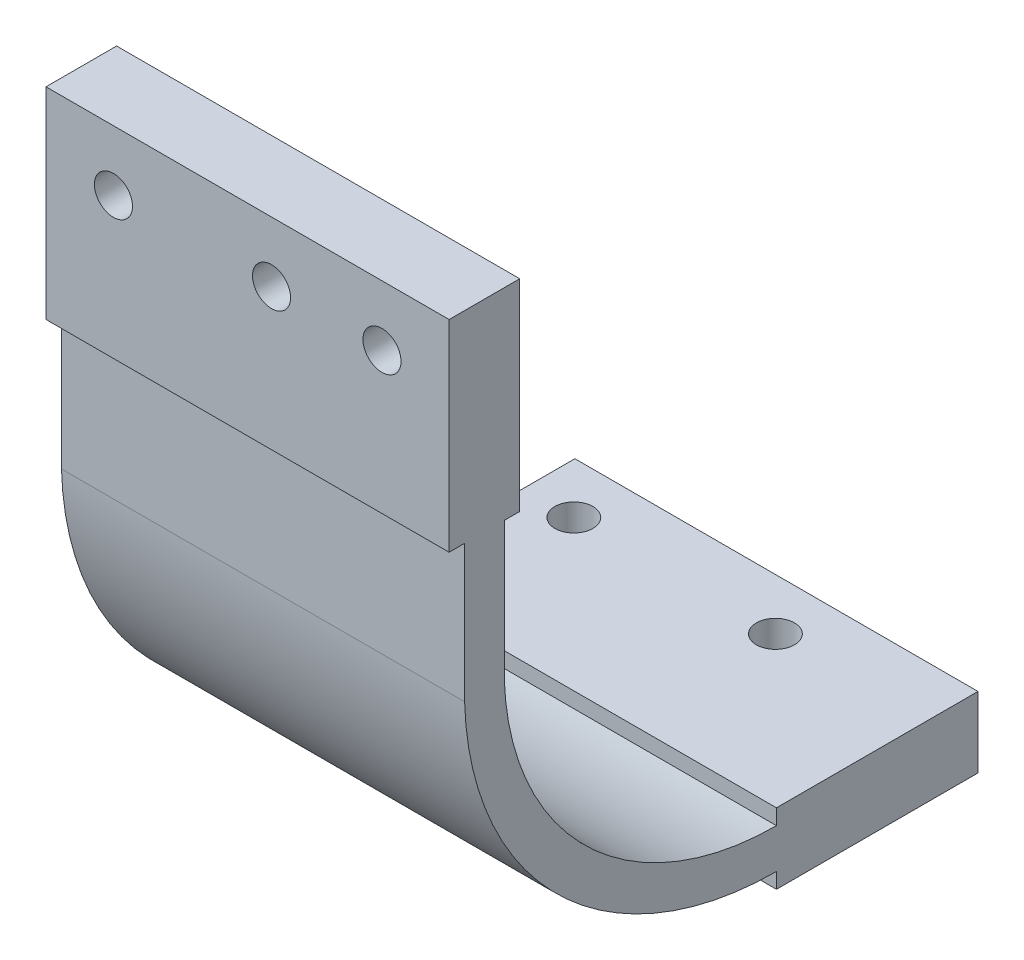
ISO-10303-21;
HEADER;
FILE_DESCRIPTION(('STEP AP214'),'2;1');
FILE_NAME('part.step','',(''),(''),'','','');
FILE_SCHEMA(('AUTOMOTIVE_DESIGN { 1 0 10303 214 1 1 1 1 }'));
ENDSEC;
DATA;
#1=APPLICATION_CONTEXT('core data for automotive mechanical design processes');
#2=APPLICATION_PROTOCOL_DEFINITION('international standard','automotive_design',2000,#1);
#3=PRODUCT_CONTEXT('',#1,'mechanical');
#4=PRODUCT('Part','Part','',(#3));
#5=PRODUCT_RELATED_PRODUCT_CATEGORY('part','',(#4));
#6=PRODUCT_DEFINITION_FORMATION('','',#4);
#7=PRODUCT_DEFINITION_CONTEXT('part definition',#1,'design');
#8=PRODUCT_DEFINITION('design','',#6,#7);
#9=PRODUCT_DEFINITION_SHAPE('','',#8);
#10=(LENGTH_UNIT() NAMED_UNIT(*) SI_UNIT(.MILLI.,.METRE.));
#11=(NAMED_UNIT(*) PLANE_ANGLE_UNIT() SI_UNIT($,.RADIAN.));
#12=(NAMED_UNIT(*) SI_UNIT($,.STERADIAN.) SOLID_ANGLE_UNIT());
#13=UNCERTAINTY_MEASURE_WITH_UNIT(LENGTH_MEASURE(1.E-05),#10,'distance_accuracy_value','');
#14=(GEOMETRIC_REPRESENTATION_CONTEXT(3) GLOBAL_UNCERTAINTY_ASSIGNED_CONTEXT((#13)) GLOBAL_UNIT_ASSIGNED_CONTEXT((#10,
#11,#12)) REPRESENTATION_CONTEXT('',''));
#15=CARTESIAN_POINT('',(0.,0.,0.));
#16=DIRECTION('',(0.,0.,1.));
#17=DIRECTION('',(1.,0.,0.));
#18=AXIS2_PLACEMENT_3D('',#15,#16,#17);
#19=CARTESIAN_POINT('',(50.8,0.,0.));
#20=DIRECTION('',(0.,0.,-1.));
#21=DIRECTION('',(0.,1.,0.));
#22=AXIS2_PLACEMENT_3D('',#19,#20,#21);
#23=PLANE('',#22);
#24=CARTESIAN_POINT('',(28.42,-7.6,0.));
#25=DIRECTION('',(0.,0.,-1.));
#26=DIRECTION('',(0.,1.,0.));
#27=AXIS2_PLACEMENT_3D('',#24,#25,#26);
#28=CIRCLE('',#27,2.4);
#29=CARTESIAN_POINT('',(28.42,-5.2,0.));
#30=VERTEX_POINT('',#29);
#31=EDGE_CURVE('E343',#30,#30,#28,.F.);
#32=ORIENTED_EDGE('',*,*,#31,.F.);
#33=EDGE_LOOP('',(#32));
#34=FACE_BOUND('',#33,.T.);
#35=CARTESIAN_POINT('',(8.49999999999999,-7.6,0.));
#36=DIRECTION('',(0.,0.,-1.));
#37=DIRECTION('',(0.,1.,0.));
#38=AXIS2_PLACEMENT_3D('',#35,#36,#37);
#39=CIRCLE('',#38,2.4);
#40=CARTESIAN_POINT('',(8.49999999999999,-5.2,0.));
#41=VERTEX_POINT('',#40);
#42=EDGE_CURVE('E347',#41,#41,#39,.F.);
#43=ORIENTED_EDGE('',*,*,#42,.F.);
#44=EDGE_LOOP('',(#43));
#45=FACE_BOUND('',#44,.T.);
#46=CARTESIAN_POINT('',(42.34,-7.6,0.));
#47=DIRECTION('',(0.,0.,-1.));
#48=DIRECTION('',(0.,1.,0.));
#49=AXIS2_PLACEMENT_3D('',#46,#47,#48);
#50=CIRCLE('',#49,2.4);
#51=CARTESIAN_POINT('',(42.34,-5.2,0.));
#52=VERTEX_POINT('',#51);
#53=EDGE_CURVE('E350',#52,#52,#50,.F.);
#54=ORIENTED_EDGE('',*,*,#53,.F.);
#55=EDGE_LOOP('',(#54));
#56=FACE_BOUND('',#55,.T.);
#57=DIRECTION('',(0.,-1.,0.));
#58=VECTOR('',#57,1.);
#59=CARTESIAN_POINT('',(0.,0.,0.));
#60=LINE('',#59,#58);
#61=CARTESIAN_POINT('',(0.,0.,0.));
#62=VERTEX_POINT('',#61);
#63=CARTESIAN_POINT('',(0.,-25.4,0.));
#64=VERTEX_POINT('',#63);
#65=EDGE_CURVE('E183',#62,#64,#60,.T.);
#66=ORIENTED_EDGE('',*,*,#65,.T.);
#67=DIRECTION('',(-1.,0.,0.));
#68=VECTOR('',#67,1.);
#69=CARTESIAN_POINT('',(50.8,-25.4,0.));
#70=LINE('',#69,#68);
#71=CARTESIAN_POINT('',(50.8,-25.4,0.));
#72=VERTEX_POINT('',#71);
#73=EDGE_CURVE('E11',#72,#64,#70,.T.);
#74=ORIENTED_EDGE('',*,*,#73,.F.);
#75=DIRECTION('',(0.,-1.,0.));
#76=VECTOR('',#75,1.);
#77=CARTESIAN_POINT('',(50.8,0.,0.));
#78=LINE('',#77,#76);
#79=CARTESIAN_POINT('',(50.8,0.,0.));
#80=VERTEX_POINT('',#79);
#81=EDGE_CURVE('E224',#80,#72,#78,.T.);
#82=ORIENTED_EDGE('',*,*,#81,.F.);
#83=DIRECTION('',(-1.,0.,0.));
#84=VECTOR('',#83,1.);
#85=CARTESIAN_POINT('',(50.8,0.,0.));
#86=LINE('',#85,#84);
#87=EDGE_CURVE('E179',#80,#62,#86,.T.);
#88=ORIENTED_EDGE('',*,*,#87,.T.);
#89=EDGE_LOOP('',(#66,#74,#82,#88));
#90=FACE_BOUND('',#89,.T.);
#91=ADVANCED_FACE('F46',(#34,#45,#56,#90),#23,.F.);
#92=CARTESIAN_POINT('',(50.8,-25.4,0.));
#93=DIRECTION('',(0.,1.,0.));
#94=DIRECTION('',(0.,0.,1.));
#95=AXIS2_PLACEMENT_3D('',#92,#93,#94);
#96=PLANE('',#95);
#97=DIRECTION('',(0.,0.,-1.));
#98=VECTOR('',#97,1.);
#99=CARTESIAN_POINT('',(0.,-25.4,0.));
#100=LINE('',#99,#98);
#101=CARTESIAN_POINT('',(0.,-25.4,-1.95));
#102=VERTEX_POINT('',#101);
#103=EDGE_CURVE('E187',#64,#102,#100,.T.);
#104=ORIENTED_EDGE('',*,*,#103,.T.);
#105=DIRECTION('',(-1.,0.,0.));
#106=VECTOR('',#105,1.);
#107=CARTESIAN_POINT('',(50.8,-25.4,-1.95));
#108=LINE('',#107,#106);
#109=CARTESIAN_POINT('',(50.8,-25.4,-1.95));
#110=VERTEX_POINT('',#109);
#111=EDGE_CURVE('E55',#110,#102,#108,.T.);
#112=ORIENTED_EDGE('',*,*,#111,.F.);
#113=DIRECTION('',(0.,0.,-1.));
#114=VECTOR('',#113,1.);
#115=CARTESIAN_POINT('',(50.8,-25.4,0.));
#116=LINE('',#115,#114);
#117=EDGE_CURVE('E124',#72,#110,#116,.T.);
#118=ORIENTED_EDGE('',*,*,#117,.F.);
#119=ORIENTED_EDGE('',*,*,#73,.T.);
#120=EDGE_LOOP('',(#104,#112,#118,#119));
#121=FACE_BOUND('',#120,.T.);
#122=ADVANCED_FACE('F334',(#121),#96,.F.);
#123=CARTESIAN_POINT('',(50.8,-25.4,-1.95));
#124=DIRECTION('',(0.,0.,-1.));
#125=DIRECTION('',(-1.,0.,0.));
#126=AXIS2_PLACEMENT_3D('',#123,#124,#125);
#127=PLANE('',#126);
#128=DIRECTION('',(0.,-1.,0.));
#129=VECTOR('',#128,1.);
#130=CARTESIAN_POINT('',(0.,-25.4,-1.95));
#131=LINE('',#130,#129);
#132=CARTESIAN_POINT('',(0.,-42.6837687485325,-1.95));
#133=VERTEX_POINT('',#132);
#134=EDGE_CURVE('E191',#102,#133,#131,.T.);
#135=ORIENTED_EDGE('',*,*,#134,.T.);
#136=DIRECTION('',(-1.,0.,0.));
#137=VECTOR('',#136,1.);
#138=CARTESIAN_POINT('',(50.8,-42.6837687485325,-1.95));
#139=LINE('',#138,#137);
#140=CARTESIAN_POINT('',(50.8,-42.6837687485325,-1.95));
#141=VERTEX_POINT('',#140);
#142=EDGE_CURVE('E259',#141,#133,#139,.T.);
#143=ORIENTED_EDGE('',*,*,#142,.F.);
#144=DIRECTION('',(0.,-1.,0.));
#145=VECTOR('',#144,1.);
#146=CARTESIAN_POINT('',(50.8,-25.4,-1.95));
#147=LINE('',#146,#145);
#148=EDGE_CURVE('E269',#110,#141,#147,.T.);
#149=ORIENTED_EDGE('',*,*,#148,.F.);
#150=ORIENTED_EDGE('',*,*,#111,.T.);
#151=EDGE_LOOP('',(#135,#143,#149,#150));
#152=FACE_BOUND('',#151,.T.);
#153=ADVANCED_FACE('F267',(#152),#127,.F.);
#154=CARTESIAN_POINT('',(50.8,-41.5475794335302,-41.25));
#155=DIRECTION('',(-1.,0.,0.));
#156=DIRECTION('',(0.,0.,1.));
#157=AXIS2_PLACEMENT_3D('',#154,#155,#156);
#158=CYLINDRICAL_SURFACE('',#157,39.3164205664698);
#159=CARTESIAN_POINT('',(0.,-41.5475794335302,-41.25));
#160=DIRECTION('',(1.,0.,0.));
#161=DIRECTION('',(0.,0.,1.));
#162=AXIS2_PLACEMENT_3D('',#159,#160,#161);
#163=CIRCLE('',#162,39.3164205664698);
#164=CARTESIAN_POINT('',(0.,-80.864,-41.25));
#165=VERTEX_POINT('',#164);
#166=EDGE_CURVE('E194',#133,#165,#163,.T.);
#167=ORIENTED_EDGE('',*,*,#166,.T.);
#168=DIRECTION('',(-1.,0.,0.));
#169=VECTOR('',#168,1.);
#170=CARTESIAN_POINT('',(50.8,-80.864,-41.25));
#171=LINE('',#170,#169);
#172=CARTESIAN_POINT('',(50.8,-80.864,-41.25));
#173=VERTEX_POINT('',#172);
#174=EDGE_CURVE('E255',#173,#165,#171,.T.);
#175=ORIENTED_EDGE('',*,*,#174,.F.);
#176=CARTESIAN_POINT('',(50.8,-41.5475794335302,-41.25));
#177=DIRECTION('',(1.,0.,0.));
#178=DIRECTION('',(0.,0.,1.));
#179=AXIS2_PLACEMENT_3D('',#176,#177,#178);
#180=CIRCLE('',#179,39.3164205664698);
#181=EDGE_CURVE('E288',#141,#173,#180,.T.);
#182=ORIENTED_EDGE('',*,*,#181,.F.);
#183=ORIENTED_EDGE('',*,*,#142,.T.);
#184=EDGE_LOOP('',(#167,#175,#182,#183));
#185=FACE_BOUND('',#184,.T.);
#186=ADVANCED_FACE('F278',(#185),#158,.T.);
#187=CARTESIAN_POINT('',(50.8,-82.814,-41.25));
#188=DIRECTION('',(0.,0.,-1.));
#189=DIRECTION('',(0.,1.,0.));
#190=AXIS2_PLACEMENT_3D('',#187,#188,#189);
#191=PLANE('',#190);
#192=DIRECTION('',(0.,-1.,0.));
#193=VECTOR('',#192,1.);
#194=CARTESIAN_POINT('',(0.,-82.814,-41.25));
#195=LINE('',#194,#193);
#196=CARTESIAN_POINT('',(0.,-82.814,-41.25));
#197=VERTEX_POINT('',#196);
#198=EDGE_CURVE('E197',#165,#197,#195,.T.);
#199=ORIENTED_EDGE('',*,*,#198,.T.);
#200=DIRECTION('',(-1.,0.,0.));
#201=VECTOR('',#200,1.);
#202=CARTESIAN_POINT('',(50.8,-82.814,-41.25));
#203=LINE('',#202,#201);
#204=CARTESIAN_POINT('',(50.8,-82.814,-41.25));
#205=VERTEX_POINT('',#204);
#206=EDGE_CURVE('E251',#205,#197,#203,.T.);
#207=ORIENTED_EDGE('',*,*,#206,.F.);
#208=DIRECTION('',(0.,-1.,0.));
#209=VECTOR('',#208,1.);
#210=CARTESIAN_POINT('',(50.8,-82.814,-41.25));
#211=LINE('',#210,#209);
#212=EDGE_CURVE('E284',#173,#205,#211,.T.);
#213=ORIENTED_EDGE('',*,*,#212,.F.);
#214=ORIENTED_EDGE('',*,*,#174,.T.);
#215=EDGE_LOOP('',(#199,#207,#213,#214));
#216=FACE_BOUND('',#215,.T.);
#217=ADVANCED_FACE('F282',(#216),#191,.F.);
#218=CARTESIAN_POINT('',(50.8,-82.814,-41.25));
#219=DIRECTION('',(0.,1.,0.));
#220=DIRECTION('',(0.,0.,1.));
#221=AXIS2_PLACEMENT_3D('',#218,#219,#220);
#222=PLANE('',#221);
#223=CARTESIAN_POINT('',(6.35,-82.814,-60.17));
#224=DIRECTION('',(0.,1.,0.));
#225=DIRECTION('',(0.,0.,1.));
#226=AXIS2_PLACEMENT_3D('',#223,#224,#225);
#227=CIRCLE('',#226,2.4);
#228=CARTESIAN_POINT('',(6.35,-82.814,-57.77));
#229=VERTEX_POINT('',#228);
#230=EDGE_CURVE('E188',#229,#229,#227,.F.);
#231=ORIENTED_EDGE('',*,*,#230,.F.);
#232=EDGE_LOOP('',(#231));
#233=FACE_BOUND('',#232,.T.);
#234=CARTESIAN_POINT('',(31.75,-82.814,-60.17));
#235=DIRECTION('',(0.,1.,0.));
#236=DIRECTION('',(0.,0.,1.));
#237=AXIS2_PLACEMENT_3D('',#234,#235,#236);
#238=CIRCLE('',#237,2.4);
#239=CARTESIAN_POINT('',(31.75,-82.814,-57.77));
#240=VERTEX_POINT('',#239);
#241=EDGE_CURVE('E353',#240,#240,#238,.F.);
#242=ORIENTED_EDGE('',*,*,#241,.F.);
#243=EDGE_LOOP('',(#242));
#244=FACE_BOUND('',#243,.T.);
#245=DIRECTION('',(0.,0.,-1.));
#246=VECTOR('',#245,1.);
#247=CARTESIAN_POINT('',(0.,-82.814,-41.25));
#248=LINE('',#247,#246);
#249=CARTESIAN_POINT('',(0.,-82.814,-66.65));
#250=VERTEX_POINT('',#249);
#251=EDGE_CURVE('E200',#197,#250,#248,.T.);
#252=ORIENTED_EDGE('',*,*,#251,.T.);
#253=DIRECTION('',(-1.,0.,0.));
#254=VECTOR('',#253,1.);
#255=CARTESIAN_POINT('',(50.8,-82.814,-66.65));
#256=LINE('',#255,#254);
#257=CARTESIAN_POINT('',(50.8,-82.814,-66.65));
#258=VERTEX_POINT('',#257);
#259=EDGE_CURVE('E247',#258,#250,#256,.T.);
#260=ORIENTED_EDGE('',*,*,#259,.F.);
#261=DIRECTION('',(0.,0.,-1.));
#262=VECTOR('',#261,1.);
#263=CARTESIAN_POINT('',(50.8,-82.814,-41.25));
#264=LINE('',#263,#262);
#265=EDGE_CURVE('E287',#205,#258,#264,.T.);
#266=ORIENTED_EDGE('',*,*,#265,.F.);
#267=ORIENTED_EDGE('',*,*,#206,.T.);
#268=EDGE_LOOP('',(#252,#260,#266,#267));
#269=FACE_BOUND('',#268,.T.);
#270=ADVANCED_FACE('F408',(#233,#244,#269),#222,.F.);
#271=CARTESIAN_POINT('',(50.8,-73.914,-66.65));
#272=DIRECTION('',(0.,0.,1.));
#273=DIRECTION('',(0.,-1.,0.));
#274=AXIS2_PLACEMENT_3D('',#271,#272,#273);
#275=PLANE('',#274);
#276=DIRECTION('',(0.,1.,0.));
#277=VECTOR('',#276,1.);
#278=CARTESIAN_POINT('',(0.,-73.914,-66.65));
#279=LINE('',#278,#277);
#280=CARTESIAN_POINT('',(0.,-73.914,-66.65));
#281=VERTEX_POINT('',#280);
#282=EDGE_CURVE('E203',#250,#281,#279,.T.);
#283=ORIENTED_EDGE('',*,*,#282,.T.);
#284=DIRECTION('',(-1.,0.,0.));
#285=VECTOR('',#284,1.);
#286=CARTESIAN_POINT('',(50.8,-73.914,-66.65));
#287=LINE('',#286,#285);
#288=CARTESIAN_POINT('',(50.8,-73.914,-66.65));
#289=VERTEX_POINT('',#288);
#290=EDGE_CURVE('E243',#289,#281,#287,.T.);
#291=ORIENTED_EDGE('',*,*,#290,.F.);
#292=DIRECTION('',(0.,1.,0.));
#293=VECTOR('',#292,1.);
#294=CARTESIAN_POINT('',(50.8,-73.914,-66.65));
#295=LINE('',#294,#293);
#296=EDGE_CURVE('E292',#258,#289,#295,.T.);
#297=ORIENTED_EDGE('',*,*,#296,.F.);
#298=ORIENTED_EDGE('',*,*,#259,.T.);
#299=EDGE_LOOP('',(#283,#291,#297,#298));
#300=FACE_BOUND('',#299,.T.);
#301=ADVANCED_FACE('F388',(#300),#275,.F.);
#302=CARTESIAN_POINT('',(50.8,-73.914,-41.25));
#303=DIRECTION('',(0.,-1.,0.));
#304=DIRECTION('',(0.,0.,-1.));
#305=AXIS2_PLACEMENT_3D('',#302,#303,#304);
#306=PLANE('',#305);
#307=CARTESIAN_POINT('',(6.35,-73.914,-60.17));
#308=DIRECTION('',(0.,1.,0.));
#309=DIRECTION('',(0.,0.,1.));
#310=AXIS2_PLACEMENT_3D('',#307,#308,#309);
#311=CIRCLE('',#310,2.4);
#312=CARTESIAN_POINT('',(6.35,-73.914,-57.77));
#313=VERTEX_POINT('',#312);
#314=EDGE_CURVE('E365',#313,#313,#311,.T.);
#315=ORIENTED_EDGE('',*,*,#314,.F.);
#316=EDGE_LOOP('',(#315));
#317=FACE_BOUND('',#316,.T.);
#318=CARTESIAN_POINT('',(31.75,-73.914,-60.17));
#319=DIRECTION('',(0.,1.,0.));
#320=DIRECTION('',(0.,0.,1.));
#321=AXIS2_PLACEMENT_3D('',#318,#319,#320);
#322=CIRCLE('',#321,2.4);
#323=CARTESIAN_POINT('',(31.75,-73.914,-57.77));
#324=VERTEX_POINT('',#323);
#325=EDGE_CURVE('E359',#324,#324,#322,.T.);
#326=ORIENTED_EDGE('',*,*,#325,.F.);
#327=EDGE_LOOP('',(#326));
#328=FACE_BOUND('',#327,.T.);
#329=DIRECTION('',(0.,0.,1.));
#330=VECTOR('',#329,1.);
#331=CARTESIAN_POINT('',(0.,-73.914,-41.25));
#332=LINE('',#331,#330);
#333=CARTESIAN_POINT('',(0.,-73.914,-41.25));
#334=VERTEX_POINT('',#333);
#335=EDGE_CURVE('E206',#281,#334,#332,.T.);
#336=ORIENTED_EDGE('',*,*,#335,.T.);
#337=DIRECTION('',(-1.,0.,0.));
#338=VECTOR('',#337,1.);
#339=CARTESIAN_POINT('',(50.8,-73.914,-41.25));
#340=LINE('',#339,#338);
#341=CARTESIAN_POINT('',(50.8,-73.914,-41.25));
#342=VERTEX_POINT('',#341);
#343=EDGE_CURVE('E239',#342,#334,#340,.T.);
#344=ORIENTED_EDGE('',*,*,#343,.F.);
#345=DIRECTION('',(0.,0.,1.));
#346=VECTOR('',#345,1.);
#347=CARTESIAN_POINT('',(50.8,-73.914,-41.25));
#348=LINE('',#347,#346);
#349=EDGE_CURVE('E299',#289,#342,#348,.T.);
#350=ORIENTED_EDGE('',*,*,#349,.F.);
#351=ORIENTED_EDGE('',*,*,#290,.T.);
#352=EDGE_LOOP('',(#336,#344,#350,#351));
#353=FACE_BOUND('',#352,.T.);
#354=ADVANCED_FACE('F384',(#317,#328,#353),#306,.F.);
#355=CARTESIAN_POINT('',(50.8,-73.914,-41.25));
#356=DIRECTION('',(0.,0.,-1.));
#357=DIRECTION('',(-1.,0.,0.));
#358=AXIS2_PLACEMENT_3D('',#355,#356,#357);
#359=PLANE('',#358);
#360=DIRECTION('',(0.,-1.,0.));
#361=VECTOR('',#360,1.);
#362=CARTESIAN_POINT('',(0.,-73.914,-41.25));
#363=LINE('',#362,#361);
#364=CARTESIAN_POINT('',(0.,-75.864,-41.25));
#365=VERTEX_POINT('',#364);
#366=EDGE_CURVE('E209',#334,#365,#363,.T.);
#367=ORIENTED_EDGE('',*,*,#366,.T.);
#368=DIRECTION('',(-1.,0.,0.));
#369=VECTOR('',#368,1.);
#370=CARTESIAN_POINT('',(50.8,-75.864,-41.25));
#371=LINE('',#370,#369);
#372=CARTESIAN_POINT('',(50.8,-75.864,-41.25));
#373=VERTEX_POINT('',#372);
#374=EDGE_CURVE('E235',#373,#365,#371,.T.);
#375=ORIENTED_EDGE('',*,*,#374,.F.);
#376=DIRECTION('',(0.,-1.,0.));
#377=VECTOR('',#376,1.);
#378=CARTESIAN_POINT('',(50.8,-73.914,-41.25));
#379=LINE('',#378,#377);
#380=EDGE_CURVE('E302',#342,#373,#379,.T.);
#381=ORIENTED_EDGE('',*,*,#380,.F.);
#382=ORIENTED_EDGE('',*,*,#343,.T.);
#383=EDGE_LOOP('',(#367,#375,#381,#382));
#384=FACE_BOUND('',#383,.T.);
#385=ADVANCED_FACE('F387',(#384),#359,.F.);
#386=CARTESIAN_POINT('',(50.8,-41.5451049832551,-41.25));
#387=DIRECTION('',(-1.,0.,0.));
#388=DIRECTION('',(0.,0.,1.));
#389=AXIS2_PLACEMENT_3D('',#386,#387,#388);
#390=CYLINDRICAL_SURFACE('',#389,34.3188950167449);
#391=CARTESIAN_POINT('',(0.,-41.5451049832551,-41.25));
#392=DIRECTION('',(-1.,0.,0.));
#393=DIRECTION('',(0.,0.,1.));
#394=AXIS2_PLACEMENT_3D('',#391,#392,#393);
#395=CIRCLE('',#394,34.3188950167449);
#396=CARTESIAN_POINT('',(0.,-42.6837687485325,-6.95));
#397=VERTEX_POINT('',#396);
#398=EDGE_CURVE('E212',#365,#397,#395,.T.);
#399=ORIENTED_EDGE('',*,*,#398,.T.);
#400=DIRECTION('',(-1.,0.,0.));
#401=VECTOR('',#400,1.);
#402=CARTESIAN_POINT('',(50.8,-42.6837687485325,-6.95));
#403=LINE('',#402,#401);
#404=CARTESIAN_POINT('',(50.8,-42.6837687485325,-6.95));
#405=VERTEX_POINT('',#404);
#406=EDGE_CURVE('E231',#405,#397,#403,.T.);
#407=ORIENTED_EDGE('',*,*,#406,.F.);
#408=CARTESIAN_POINT('',(50.8,-41.5451049832551,-41.25));
#409=DIRECTION('',(-1.,0.,0.));
#410=DIRECTION('',(0.,0.,1.));
#411=AXIS2_PLACEMENT_3D('',#408,#409,#410);
#412=CIRCLE('',#411,34.3188950167449);
#413=EDGE_CURVE('E305',#373,#405,#412,.T.);
#414=ORIENTED_EDGE('',*,*,#413,.F.);
#415=ORIENTED_EDGE('',*,*,#374,.T.);
#416=EDGE_LOOP('',(#399,#407,#414,#415));
#417=FACE_BOUND('',#416,.T.);
#418=ADVANCED_FACE('F313',(#417),#390,.F.);
#419=CARTESIAN_POINT('',(50.8,-25.4,-6.95));
#420=DIRECTION('',(0.,0.,1.));
#421=DIRECTION('',(1.,0.,0.));
#422=AXIS2_PLACEMENT_3D('',#419,#420,#421);
#423=PLANE('',#422);
#424=DIRECTION('',(0.,1.,0.));
#425=VECTOR('',#424,1.);
#426=CARTESIAN_POINT('',(0.,-25.4,-6.95));
#427=LINE('',#426,#425);
#428=CARTESIAN_POINT('',(0.,-25.4,-6.95));
#429=VERTEX_POINT('',#428);
#430=EDGE_CURVE('E215',#397,#429,#427,.T.);
#431=ORIENTED_EDGE('',*,*,#430,.T.);
#432=DIRECTION('',(-1.,0.,0.));
#433=VECTOR('',#432,1.);
#434=CARTESIAN_POINT('',(50.8,-25.4,-6.95));
#435=LINE('',#434,#433);
#436=CARTESIAN_POINT('',(50.8,-25.4,-6.95));
#437=VERTEX_POINT('',#436);
#438=EDGE_CURVE('E172',#437,#429,#435,.T.);
#439=ORIENTED_EDGE('',*,*,#438,.F.);
#440=DIRECTION('',(0.,1.,0.));
#441=VECTOR('',#440,1.);
#442=CARTESIAN_POINT('',(50.8,-25.4,-6.95));
#443=LINE('',#442,#441);
#444=EDGE_CURVE('E161',#405,#437,#443,.T.);
#445=ORIENTED_EDGE('',*,*,#444,.F.);
#446=ORIENTED_EDGE('',*,*,#406,.T.);
#447=EDGE_LOOP('',(#431,#439,#445,#446));
#448=FACE_BOUND('',#447,.T.);
#449=ADVANCED_FACE('F317',(#448),#423,.F.);
#450=CARTESIAN_POINT('',(50.8,-25.4,-6.95));
#451=DIRECTION('',(0.,1.,0.));
#452=DIRECTION('',(0.,0.,1.));
#453=AXIS2_PLACEMENT_3D('',#450,#451,#452);
#454=PLANE('',#453);
#455=DIRECTION('',(0.,0.,-1.));
#456=VECTOR('',#455,1.);
#457=CARTESIAN_POINT('',(0.,-25.4,-6.95));
#458=LINE('',#457,#456);
#459=CARTESIAN_POINT('',(0.,-25.4,-8.90000000000001));
#460=VERTEX_POINT('',#459);
#461=EDGE_CURVE('E170',#429,#460,#458,.T.);
#462=ORIENTED_EDGE('',*,*,#461,.T.);
#463=DIRECTION('',(-1.,0.,0.));
#464=VECTOR('',#463,1.);
#465=CARTESIAN_POINT('',(50.8,-25.4,-8.90000000000001));
#466=LINE('',#465,#464);
#467=CARTESIAN_POINT('',(50.8,-25.4,-8.90000000000001));
#468=VERTEX_POINT('',#467);
#469=EDGE_CURVE('E167',#468,#460,#466,.T.);
#470=ORIENTED_EDGE('',*,*,#469,.F.);
#471=DIRECTION('',(0.,0.,-1.));
#472=VECTOR('',#471,1.);
#473=CARTESIAN_POINT('',(50.8,-25.4,-6.95));
#474=LINE('',#473,#472);
#475=EDGE_CURVE('E155',#437,#468,#474,.T.);
#476=ORIENTED_EDGE('',*,*,#475,.F.);
#477=ORIENTED_EDGE('',*,*,#438,.T.);
#478=EDGE_LOOP('',(#462,#470,#476,#477));
#479=FACE_BOUND('',#478,.T.);
#480=ADVANCED_FACE('F168',(#479),#454,.F.);
#481=CARTESIAN_POINT('',(50.8,0.,-8.9));
#482=DIRECTION('',(0.,0.,1.));
#483=DIRECTION('',(0.,-1.,0.));
#484=AXIS2_PLACEMENT_3D('',#481,#482,#483);
#485=PLANE('',#484);
#486=CARTESIAN_POINT('',(28.42,-7.6,-8.9));
#487=DIRECTION('',(0.,0.,-1.));
#488=DIRECTION('',(0.,1.,0.));
#489=AXIS2_PLACEMENT_3D('',#486,#487,#488);
#490=CIRCLE('',#489,2.4);
#491=CARTESIAN_POINT('',(28.42,-5.2,-8.9));
#492=VERTEX_POINT('',#491);
#493=EDGE_CURVE('E548',#492,#492,#490,.T.);
#494=ORIENTED_EDGE('',*,*,#493,.F.);
#495=EDGE_LOOP('',(#494));
#496=FACE_BOUND('',#495,.T.);
#497=CARTESIAN_POINT('',(8.49999999999999,-7.6,-8.9));
#498=DIRECTION('',(0.,0.,-1.));
#499=DIRECTION('',(0.,1.,0.));
#500=AXIS2_PLACEMENT_3D('',#497,#498,#499);
#501=CIRCLE('',#500,2.4);
#502=CARTESIAN_POINT('',(8.49999999999999,-5.2,-8.9));
#503=VERTEX_POINT('',#502);
#504=EDGE_CURVE('E554',#503,#503,#501,.T.);
#505=ORIENTED_EDGE('',*,*,#504,.F.);
#506=EDGE_LOOP('',(#505));
#507=FACE_BOUND('',#506,.T.);
#508=CARTESIAN_POINT('',(42.34,-7.6,-8.9));
#509=DIRECTION('',(0.,0.,-1.));
#510=DIRECTION('',(0.,1.,0.));
#511=AXIS2_PLACEMENT_3D('',#508,#509,#510);
#512=CIRCLE('',#511,2.4);
#513=CARTESIAN_POINT('',(42.34,-5.2,-8.9));
#514=VERTEX_POINT('',#513);
#515=EDGE_CURVE('E354',#514,#514,#512,.T.);
#516=ORIENTED_EDGE('',*,*,#515,.F.);
#517=EDGE_LOOP('',(#516));
#518=FACE_BOUND('',#517,.T.);
#519=DIRECTION('',(0.,1.,0.));
#520=VECTOR('',#519,1.);
#521=CARTESIAN_POINT('',(0.,0.,-8.9));
#522=LINE('',#521,#520);
#523=CARTESIAN_POINT('',(0.,0.,-8.9));
#524=VERTEX_POINT('',#523);
#525=EDGE_CURVE('E110',#460,#524,#522,.T.);
#526=ORIENTED_EDGE('',*,*,#525,.T.);
#527=DIRECTION('',(-1.,0.,0.));
#528=VECTOR('',#527,1.);
#529=CARTESIAN_POINT('',(50.8,0.,-8.9));
#530=LINE('',#529,#528);
#531=CARTESIAN_POINT('',(50.8,0.,-8.9));
#532=VERTEX_POINT('',#531);
#533=EDGE_CURVE('E173',#532,#524,#530,.T.);
#534=ORIENTED_EDGE('',*,*,#533,.F.);
#535=DIRECTION('',(0.,1.,0.));
#536=VECTOR('',#535,1.);
#537=CARTESIAN_POINT('',(50.8,0.,-8.9));
#538=LINE('',#537,#536);
#539=EDGE_CURVE('E159',#468,#532,#538,.T.);
#540=ORIENTED_EDGE('',*,*,#539,.F.);
#541=ORIENTED_EDGE('',*,*,#469,.T.);
#542=EDGE_LOOP('',(#526,#534,#540,#541));
#543=FACE_BOUND('',#542,.T.);
#544=ADVANCED_FACE('F175',(#496,#507,#518,#543),#485,.F.);
#545=CARTESIAN_POINT('',(50.8,0.,0.));
#546=DIRECTION('',(0.,-1.,0.));
#547=DIRECTION('',(0.,0.,-1.));
#548=AXIS2_PLACEMENT_3D('',#545,#546,#547);
#549=PLANE('',#548);
#550=DIRECTION('',(0.,0.,1.));
#551=VECTOR('',#550,1.);
#552=CARTESIAN_POINT('',(0.,0.,0.));
#553=LINE('',#552,#551);
#554=EDGE_CURVE('E116',#524,#62,#553,.T.);
#555=ORIENTED_EDGE('',*,*,#554,.T.);
#556=ORIENTED_EDGE('',*,*,#87,.F.);
#557=DIRECTION('',(0.,0.,1.));
#558=VECTOR('',#557,1.);
#559=CARTESIAN_POINT('',(50.8,0.,0.));
#560=LINE('',#559,#558);
#561=EDGE_CURVE('E63',#532,#80,#560,.T.);
#562=ORIENTED_EDGE('',*,*,#561,.F.);
#563=ORIENTED_EDGE('',*,*,#533,.T.);
#564=EDGE_LOOP('',(#555,#556,#562,#563));
#565=FACE_BOUND('',#564,.T.);
#566=ADVANCED_FACE('F321',(#565),#549,.F.);
#567=CARTESIAN_POINT('',(50.8,-41.5475794335302,-41.25));
#568=DIRECTION('',(-1.,0.,0.));
#569=DIRECTION('',(0.,0.,1.));
#570=AXIS2_PLACEMENT_3D('',#567,#568,#569);
#571=PLANE('',#570);
#572=ORIENTED_EDGE('',*,*,#81,.T.);
#573=ORIENTED_EDGE('',*,*,#117,.T.);
#574=ORIENTED_EDGE('',*,*,#148,.T.);
#575=ORIENTED_EDGE('',*,*,#181,.T.);
#576=ORIENTED_EDGE('',*,*,#212,.T.);
#577=ORIENTED_EDGE('',*,*,#265,.T.);
#578=ORIENTED_EDGE('',*,*,#296,.T.);
#579=ORIENTED_EDGE('',*,*,#349,.T.);
#580=ORIENTED_EDGE('',*,*,#380,.T.);
#581=ORIENTED_EDGE('',*,*,#413,.T.);
#582=ORIENTED_EDGE('',*,*,#444,.T.);
#583=ORIENTED_EDGE('',*,*,#475,.T.);
#584=ORIENTED_EDGE('',*,*,#539,.T.);
#585=ORIENTED_EDGE('',*,*,#561,.T.);
#586=EDGE_LOOP('',(#572,#573,#574,#575,#576,#577,#578,#579,#580,#581,#582,#583,#584,#585));
#587=FACE_BOUND('',#586,.T.);
#588=ADVANCED_FACE('F157',(#587),#571,.F.);
#589=CARTESIAN_POINT('',(0.,-41.5475794335302,-41.25));
#590=DIRECTION('',(-1.,0.,0.));
#591=DIRECTION('',(0.,0.,1.));
#592=AXIS2_PLACEMENT_3D('',#589,#590,#591);
#593=PLANE('',#592);
#594=ORIENTED_EDGE('',*,*,#65,.F.);
#595=ORIENTED_EDGE('',*,*,#554,.F.);
#596=ORIENTED_EDGE('',*,*,#525,.F.);
#597=ORIENTED_EDGE('',*,*,#461,.F.);
#598=ORIENTED_EDGE('',*,*,#430,.F.);
#599=ORIENTED_EDGE('',*,*,#398,.F.);
#600=ORIENTED_EDGE('',*,*,#366,.F.);
#601=ORIENTED_EDGE('',*,*,#335,.F.);
#602=ORIENTED_EDGE('',*,*,#282,.F.);
#603=ORIENTED_EDGE('',*,*,#251,.F.);
#604=ORIENTED_EDGE('',*,*,#198,.F.);
#605=ORIENTED_EDGE('',*,*,#166,.F.);
#606=ORIENTED_EDGE('',*,*,#134,.F.);
#607=ORIENTED_EDGE('',*,*,#103,.F.);
#608=EDGE_LOOP('',(#594,#595,#596,#597,#598,#599,#600,#601,#602,#603,#604,#605,#606,#607));
#609=FACE_BOUND('',#608,.T.);
#610=ADVANCED_FACE('F273',(#609),#593,.T.);
#611=CARTESIAN_POINT('',(31.75,-82.815,-60.17));
#612=DIRECTION('',(0.,1.,0.));
#613=DIRECTION('',(0.,0.,1.));
#614=AXIS2_PLACEMENT_3D('',#611,#612,#613);
#615=CYLINDRICAL_SURFACE('',#614,2.4);
#616=ORIENTED_EDGE('',*,*,#325,.T.);
#617=EDGE_LOOP('',(#616));
#618=FACE_BOUND('',#617,.T.);
#619=ORIENTED_EDGE('',*,*,#241,.T.);
#620=EDGE_LOOP('',(#619));
#621=FACE_BOUND('',#620,.T.);
#622=ADVANCED_FACE('F381',(#618,#621),#615,.F.);
#623=CARTESIAN_POINT('',(6.35,-82.815,-60.17));
#624=DIRECTION('',(0.,1.,0.));
#625=DIRECTION('',(0.,0.,1.));
#626=AXIS2_PLACEMENT_3D('',#623,#624,#625);
#627=CYLINDRICAL_SURFACE('',#626,2.4);
#628=ORIENTED_EDGE('',*,*,#314,.T.);
#629=EDGE_LOOP('',(#628));
#630=FACE_BOUND('',#629,.T.);
#631=ORIENTED_EDGE('',*,*,#230,.T.);
#632=EDGE_LOOP('',(#631));
#633=FACE_BOUND('',#632,.T.);
#634=ADVANCED_FACE('F504',(#630,#633),#627,.F.);
#635=CARTESIAN_POINT('',(42.34,-7.6,0.00100000000001488));
#636=DIRECTION('',(0.,0.,-1.));
#637=DIRECTION('',(0.,1.,0.));
#638=AXIS2_PLACEMENT_3D('',#635,#636,#637);
#639=CYLINDRICAL_SURFACE('',#638,2.4);
#640=ORIENTED_EDGE('',*,*,#515,.T.);
#641=EDGE_LOOP('',(#640));
#642=FACE_BOUND('',#641,.T.);
#643=ORIENTED_EDGE('',*,*,#53,.T.);
#644=EDGE_LOOP('',(#643));
#645=FACE_BOUND('',#644,.T.);
#646=ADVANCED_FACE('F513',(#642,#645),#639,.F.);
#647=CARTESIAN_POINT('',(8.49999999999999,-7.6,0.00100000000001488));
#648=DIRECTION('',(0.,0.,-1.));
#649=DIRECTION('',(0.,1.,0.));
#650=AXIS2_PLACEMENT_3D('',#647,#648,#649);
#651=CYLINDRICAL_SURFACE('',#650,2.4);
#652=ORIENTED_EDGE('',*,*,#504,.T.);
#653=EDGE_LOOP('',(#652));
#654=FACE_BOUND('',#653,.T.);
#655=ORIENTED_EDGE('',*,*,#42,.T.);
#656=EDGE_LOOP('',(#655));
#657=FACE_BOUND('',#656,.T.);
#658=ADVANCED_FACE('F522',(#654,#657),#651,.F.);
#659=CARTESIAN_POINT('',(28.42,-7.6,0.00100000000001488));
#660=DIRECTION('',(0.,0.,-1.));
#661=DIRECTION('',(0.,1.,0.));
#662=AXIS2_PLACEMENT_3D('',#659,#660,#661);
#663=CYLINDRICAL_SURFACE('',#662,2.4);
#664=ORIENTED_EDGE('',*,*,#493,.T.);
#665=EDGE_LOOP('',(#664));
#666=FACE_BOUND('',#665,.T.);
#667=ORIENTED_EDGE('',*,*,#31,.T.);
#668=EDGE_LOOP('',(#667));
#669=FACE_BOUND('',#668,.T.);
#670=ADVANCED_FACE('F532',(#666,#669),#663,.F.);
#671=CLOSED_SHELL('',(#91,#122,#153,#186,#217,#270,#301,#354,#385,#418,#449,#480,#544,#566,#588,
#610,#622,#634,#646,#658,#670));
#672=MANIFOLD_SOLID_BREP('B2',#671);
#673=ADVANCED_BREP_SHAPE_REPRESENTATION('',(#18,#672),#14);
#674=SHAPE_DEFINITION_REPRESENTATION(#9,#673);
ENDSEC;
END-ISO-10303-21;
